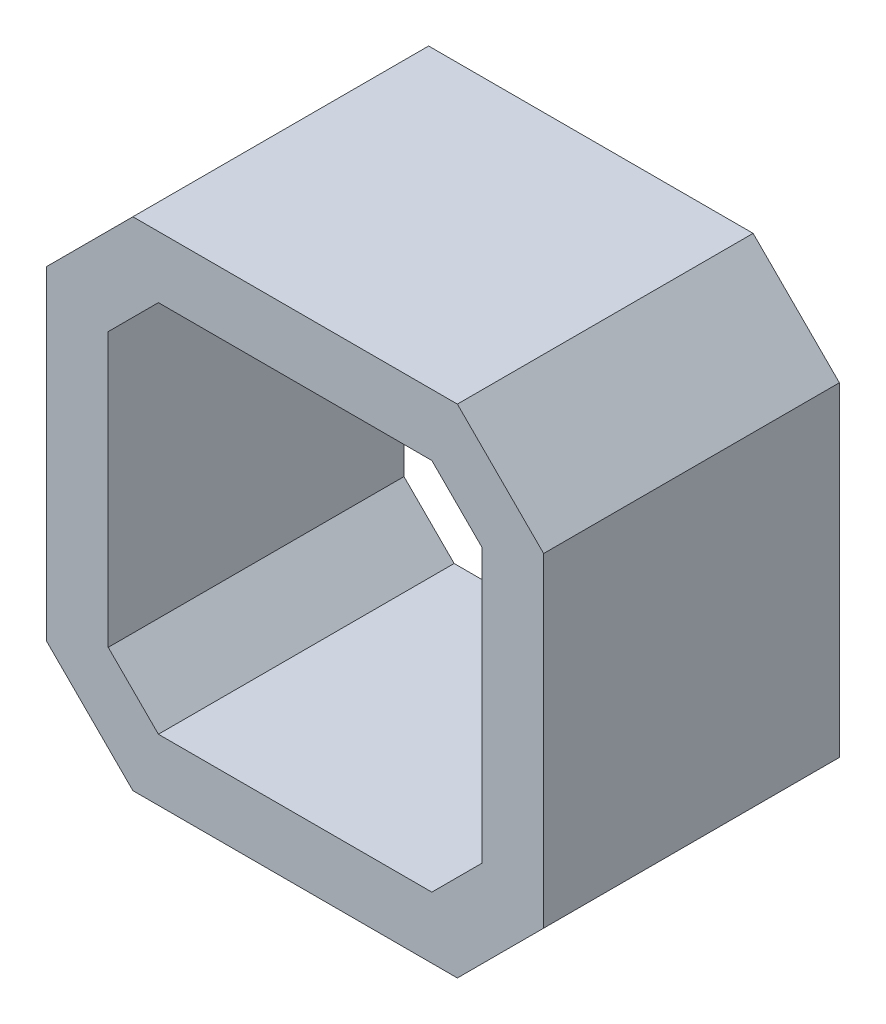
ISO-10303-21;
HEADER;
FILE_DESCRIPTION(('STEP AP214'),'2;1');
FILE_NAME('part.step','',(''),(''),'','','');
FILE_SCHEMA(('AUTOMOTIVE_DESIGN { 1 0 10303 214 1 1 1 1 }'));
ENDSEC;
DATA;
#1=APPLICATION_CONTEXT('core data for automotive mechanical design processes');
#2=APPLICATION_PROTOCOL_DEFINITION('international standard','automotive_design',2000,#1);
#3=PRODUCT_CONTEXT('',#1,'mechanical');
#4=PRODUCT('Part','Part','',(#3));
#5=PRODUCT_RELATED_PRODUCT_CATEGORY('part','',(#4));
#6=PRODUCT_DEFINITION_FORMATION('','',#4);
#7=PRODUCT_DEFINITION_CONTEXT('part definition',#1,'design');
#8=PRODUCT_DEFINITION('design','',#6,#7);
#9=PRODUCT_DEFINITION_SHAPE('','',#8);
#10=(LENGTH_UNIT() NAMED_UNIT(*) SI_UNIT(.MILLI.,.METRE.));
#11=(NAMED_UNIT(*) PLANE_ANGLE_UNIT() SI_UNIT($,.RADIAN.));
#12=(NAMED_UNIT(*) SI_UNIT($,.STERADIAN.) SOLID_ANGLE_UNIT());
#13=UNCERTAINTY_MEASURE_WITH_UNIT(LENGTH_MEASURE(1.E-05),#10,'distance_accuracy_value','');
#14=(GEOMETRIC_REPRESENTATION_CONTEXT(3) GLOBAL_UNCERTAINTY_ASSIGNED_CONTEXT((#13)) GLOBAL_UNIT_ASSIGNED_CONTEXT((#10,
#11,#12)) REPRESENTATION_CONTEXT('',''));
#15=CARTESIAN_POINT('',(0.,0.,0.));
#16=DIRECTION('',(0.,0.,1.));
#17=DIRECTION('',(1.,0.,0.));
#18=AXIS2_PLACEMENT_3D('',#15,#16,#17);
#19=CARTESIAN_POINT('',(0.,0.,-54.));
#20=DIRECTION('',(0.,0.,1.));
#21=DIRECTION('',(-1.,0.,0.));
#22=AXIS2_PLACEMENT_3D('',#19,#20,#21);
#23=PLANE('',#22);
#24=DIRECTION('',(-1.,0.,0.));
#25=VECTOR('',#24,1.);
#26=CARTESIAN_POINT('',(19.75,30.25,-54.));
#27=LINE('',#26,#25);
#28=CARTESIAN_POINT('',(19.75,30.25,-54.));
#29=VERTEX_POINT('',#28);
#30=CARTESIAN_POINT('',(-19.75,30.25,-54.));
#31=VERTEX_POINT('',#30);
#32=EDGE_CURVE('E223',#29,#31,#27,.T.);
#33=ORIENTED_EDGE('',*,*,#32,.F.);
#34=DIRECTION('',(-0.707106781186548,0.707106781186548,0.));
#35=VECTOR('',#34,1.);
#36=CARTESIAN_POINT('',(30.25,19.75,-54.));
#37=LINE('',#36,#35);
#38=CARTESIAN_POINT('',(30.25,19.75,-54.));
#39=VERTEX_POINT('',#38);
#40=EDGE_CURVE('E245',#39,#29,#37,.T.);
#41=ORIENTED_EDGE('',*,*,#40,.F.);
#42=DIRECTION('',(0.,1.,0.));
#43=VECTOR('',#42,1.);
#44=CARTESIAN_POINT('',(30.25,-19.75,-54.));
#45=LINE('',#44,#43);
#46=CARTESIAN_POINT('',(30.25,-19.75,-54.));
#47=VERTEX_POINT('',#46);
#48=EDGE_CURVE('E242',#47,#39,#45,.T.);
#49=ORIENTED_EDGE('',*,*,#48,.F.);
#50=DIRECTION('',(0.707106781186548,0.707106781186547,0.));
#51=VECTOR('',#50,1.);
#52=CARTESIAN_POINT('',(30.25,-19.75,-54.));
#53=LINE('',#52,#51);
#54=CARTESIAN_POINT('',(19.75,-30.25,-54.));
#55=VERTEX_POINT('',#54);
#56=EDGE_CURVE('E239',#55,#47,#53,.T.);
#57=ORIENTED_EDGE('',*,*,#56,.F.);
#58=DIRECTION('',(1.,0.,0.));
#59=VECTOR('',#58,1.);
#60=CARTESIAN_POINT('',(19.75,-30.25,-54.));
#61=LINE('',#60,#59);
#62=CARTESIAN_POINT('',(-19.75,-30.25,-54.));
#63=VERTEX_POINT('',#62);
#64=EDGE_CURVE('E236',#63,#55,#61,.T.);
#65=ORIENTED_EDGE('',*,*,#64,.F.);
#66=DIRECTION('',(0.707106781186548,-0.707106781186547,0.));
#67=VECTOR('',#66,1.);
#68=CARTESIAN_POINT('',(-19.75,-30.25,-54.));
#69=LINE('',#68,#67);
#70=CARTESIAN_POINT('',(-30.25,-19.75,-54.));
#71=VERTEX_POINT('',#70);
#72=EDGE_CURVE('E233',#71,#63,#69,.T.);
#73=ORIENTED_EDGE('',*,*,#72,.F.);
#74=DIRECTION('',(0.,-1.,0.));
#75=VECTOR('',#74,1.);
#76=CARTESIAN_POINT('',(-30.25,-19.75,-54.));
#77=LINE('',#76,#75);
#78=CARTESIAN_POINT('',(-30.25,19.75,-54.));
#79=VERTEX_POINT('',#78);
#80=EDGE_CURVE('E230',#79,#71,#77,.T.);
#81=ORIENTED_EDGE('',*,*,#80,.F.);
#82=DIRECTION('',(-0.707106781186548,-0.707106781186548,0.));
#83=VECTOR('',#82,1.);
#84=CARTESIAN_POINT('',(-19.75,30.25,-54.));
#85=LINE('',#84,#83);
#86=EDGE_CURVE('E226',#31,#79,#85,.T.);
#87=ORIENTED_EDGE('',*,*,#86,.F.);
#88=EDGE_LOOP('',(#33,#41,#49,#57,#65,#73,#81,#87));
#89=FACE_BOUND('',#88,.T.);
#90=DIRECTION('',(-0.707106781186548,0.707106781186548,0.));
#91=VECTOR('',#90,1.);
#92=CARTESIAN_POINT('',(22.75,16.6433982822018,-54.));
#93=LINE('',#92,#91);
#94=CARTESIAN_POINT('',(22.75,16.6433982822018,-54.));
#95=VERTEX_POINT('',#94);
#96=CARTESIAN_POINT('',(16.6433982822018,22.75,-54.));
#97=VERTEX_POINT('',#96);
#98=EDGE_CURVE('E158',#95,#97,#93,.T.);
#99=ORIENTED_EDGE('',*,*,#98,.T.);
#100=DIRECTION('',(-1.,0.,0.));
#101=VECTOR('',#100,1.);
#102=CARTESIAN_POINT('',(16.6433982822018,22.75,-54.));
#103=LINE('',#102,#101);
#104=CARTESIAN_POINT('',(-16.6433982822018,22.75,-54.));
#105=VERTEX_POINT('',#104);
#106=EDGE_CURVE('E167',#97,#105,#103,.T.);
#107=ORIENTED_EDGE('',*,*,#106,.T.);
#108=DIRECTION('',(-0.707106781186547,-0.707106781186548,0.));
#109=VECTOR('',#108,1.);
#110=CARTESIAN_POINT('',(-16.6433982822018,22.75,-54.));
#111=LINE('',#110,#109);
#112=CARTESIAN_POINT('',(-22.75,16.6433982822018,-54.));
#113=VERTEX_POINT('',#112);
#114=EDGE_CURVE('E172',#105,#113,#111,.T.);
#115=ORIENTED_EDGE('',*,*,#114,.T.);
#116=DIRECTION('',(0.,-1.,0.));
#117=VECTOR('',#116,1.);
#118=CARTESIAN_POINT('',(-22.75,-16.6433982822018,-54.));
#119=LINE('',#118,#117);
#120=CARTESIAN_POINT('',(-22.75,-16.6433982822018,-54.));
#121=VERTEX_POINT('',#120);
#122=EDGE_CURVE('E184',#113,#121,#119,.T.);
#123=ORIENTED_EDGE('',*,*,#122,.T.);
#124=DIRECTION('',(0.707106781186548,-0.707106781186547,0.));
#125=VECTOR('',#124,1.);
#126=CARTESIAN_POINT('',(-16.6433982822018,-22.75,-54.));
#127=LINE('',#126,#125);
#128=CARTESIAN_POINT('',(-16.6433982822018,-22.75,-54.));
#129=VERTEX_POINT('',#128);
#130=EDGE_CURVE('E187',#121,#129,#127,.T.);
#131=ORIENTED_EDGE('',*,*,#130,.T.);
#132=DIRECTION('',(1.,0.,0.));
#133=VECTOR('',#132,1.);
#134=CARTESIAN_POINT('',(16.6433982822018,-22.75,-54.));
#135=LINE('',#134,#133);
#136=CARTESIAN_POINT('',(16.6433982822018,-22.75,-54.));
#137=VERTEX_POINT('',#136);
#138=EDGE_CURVE('E190',#129,#137,#135,.T.);
#139=ORIENTED_EDGE('',*,*,#138,.T.);
#140=DIRECTION('',(0.707106781186548,0.707106781186547,0.));
#141=VECTOR('',#140,1.);
#142=CARTESIAN_POINT('',(22.75,-16.6433982822018,-54.));
#143=LINE('',#142,#141);
#144=CARTESIAN_POINT('',(22.75,-16.6433982822018,-54.));
#145=VERTEX_POINT('',#144);
#146=EDGE_CURVE('E193',#137,#145,#143,.T.);
#147=ORIENTED_EDGE('',*,*,#146,.T.);
#148=DIRECTION('',(0.,1.,0.));
#149=VECTOR('',#148,1.);
#150=CARTESIAN_POINT('',(22.75,-16.6433982822018,-54.));
#151=LINE('',#150,#149);
#152=EDGE_CURVE('E176',#145,#95,#151,.T.);
#153=ORIENTED_EDGE('',*,*,#152,.T.);
#154=EDGE_LOOP('',(#99,#107,#115,#123,#131,#139,#147,#153));
#155=FACE_BOUND('',#154,.T.);
#156=ADVANCED_FACE('F43',(#89,#155),#23,.F.);
#157=CARTESIAN_POINT('',(0.,0.,-18.));
#158=DIRECTION('',(0.,0.,1.));
#159=DIRECTION('',(-1.,0.,0.));
#160=AXIS2_PLACEMENT_3D('',#157,#158,#159);
#161=PLANE('',#160);
#162=DIRECTION('',(-1.,0.,0.));
#163=VECTOR('',#162,1.);
#164=CARTESIAN_POINT('',(19.75,30.25,-18.));
#165=LINE('',#164,#163);
#166=CARTESIAN_POINT('',(19.75,30.25,-18.));
#167=VERTEX_POINT('',#166);
#168=CARTESIAN_POINT('',(-19.75,30.25,-18.));
#169=VERTEX_POINT('',#168);
#170=EDGE_CURVE('E163',#167,#169,#165,.T.);
#171=ORIENTED_EDGE('',*,*,#170,.T.);
#172=DIRECTION('',(-0.707106781186548,-0.707106781186548,0.));
#173=VECTOR('',#172,1.);
#174=CARTESIAN_POINT('',(-19.75,30.25,-18.));
#175=LINE('',#174,#173);
#176=CARTESIAN_POINT('',(-30.25,19.75,-18.));
#177=VERTEX_POINT('',#176);
#178=EDGE_CURVE('E251',#169,#177,#175,.T.);
#179=ORIENTED_EDGE('',*,*,#178,.T.);
#180=DIRECTION('',(0.,-1.,0.));
#181=VECTOR('',#180,1.);
#182=CARTESIAN_POINT('',(-30.25,-19.75,-18.));
#183=LINE('',#182,#181);
#184=CARTESIAN_POINT('',(-30.25,-19.75,-18.));
#185=VERTEX_POINT('',#184);
#186=EDGE_CURVE('E254',#177,#185,#183,.T.);
#187=ORIENTED_EDGE('',*,*,#186,.T.);
#188=DIRECTION('',(0.707106781186548,-0.707106781186547,0.));
#189=VECTOR('',#188,1.);
#190=CARTESIAN_POINT('',(-19.75,-30.25,-18.));
#191=LINE('',#190,#189);
#192=CARTESIAN_POINT('',(-19.75,-30.25,-18.));
#193=VERTEX_POINT('',#192);
#194=EDGE_CURVE('E257',#185,#193,#191,.T.);
#195=ORIENTED_EDGE('',*,*,#194,.T.);
#196=DIRECTION('',(1.,0.,0.));
#197=VECTOR('',#196,1.);
#198=CARTESIAN_POINT('',(19.75,-30.25,-18.));
#199=LINE('',#198,#197);
#200=CARTESIAN_POINT('',(19.75,-30.25,-18.));
#201=VERTEX_POINT('',#200);
#202=EDGE_CURVE('E260',#193,#201,#199,.T.);
#203=ORIENTED_EDGE('',*,*,#202,.T.);
#204=DIRECTION('',(0.707106781186548,0.707106781186547,0.));
#205=VECTOR('',#204,1.);
#206=CARTESIAN_POINT('',(30.25,-19.75,-18.));
#207=LINE('',#206,#205);
#208=CARTESIAN_POINT('',(30.25,-19.75,-18.));
#209=VERTEX_POINT('',#208);
#210=EDGE_CURVE('E263',#201,#209,#207,.T.);
#211=ORIENTED_EDGE('',*,*,#210,.T.);
#212=DIRECTION('',(0.,1.,0.));
#213=VECTOR('',#212,1.);
#214=CARTESIAN_POINT('',(30.25,-19.75,-18.));
#215=LINE('',#214,#213);
#216=CARTESIAN_POINT('',(30.25,19.75,-18.));
#217=VERTEX_POINT('',#216);
#218=EDGE_CURVE('E266',#209,#217,#215,.T.);
#219=ORIENTED_EDGE('',*,*,#218,.T.);
#220=DIRECTION('',(-0.707106781186548,0.707106781186548,0.));
#221=VECTOR('',#220,1.);
#222=CARTESIAN_POINT('',(30.25,19.75,-18.));
#223=LINE('',#222,#221);
#224=EDGE_CURVE('E227',#217,#167,#223,.T.);
#225=ORIENTED_EDGE('',*,*,#224,.T.);
#226=EDGE_LOOP('',(#171,#179,#187,#195,#203,#211,#219,#225));
#227=FACE_BOUND('',#226,.T.);
#228=DIRECTION('',(0.,1.,0.));
#229=VECTOR('',#228,1.);
#230=CARTESIAN_POINT('',(22.75,-16.6433982822018,-18.));
#231=LINE('',#230,#229);
#232=CARTESIAN_POINT('',(22.75,-16.6433982822018,-18.));
#233=VERTEX_POINT('',#232);
#234=CARTESIAN_POINT('',(22.75,16.6433982822018,-18.));
#235=VERTEX_POINT('',#234);
#236=EDGE_CURVE('E177',#233,#235,#231,.T.);
#237=ORIENTED_EDGE('',*,*,#236,.F.);
#238=DIRECTION('',(0.707106781186548,0.707106781186547,0.));
#239=VECTOR('',#238,1.);
#240=CARTESIAN_POINT('',(22.75,-16.6433982822018,-18.));
#241=LINE('',#240,#239);
#242=CARTESIAN_POINT('',(16.6433982822018,-22.75,-18.));
#243=VERTEX_POINT('',#242);
#244=EDGE_CURVE('E180',#243,#233,#241,.T.);
#245=ORIENTED_EDGE('',*,*,#244,.F.);
#246=DIRECTION('',(1.,0.,0.));
#247=VECTOR('',#246,1.);
#248=CARTESIAN_POINT('',(16.6433982822018,-22.75,-18.));
#249=LINE('',#248,#247);
#250=CARTESIAN_POINT('',(-16.6433982822018,-22.75,-18.));
#251=VERTEX_POINT('',#250);
#252=EDGE_CURVE('E208',#251,#243,#249,.T.);
#253=ORIENTED_EDGE('',*,*,#252,.F.);
#254=DIRECTION('',(0.707106781186548,-0.707106781186547,0.));
#255=VECTOR('',#254,1.);
#256=CARTESIAN_POINT('',(-16.6433982822018,-22.75,-18.));
#257=LINE('',#256,#255);
#258=CARTESIAN_POINT('',(-22.75,-16.6433982822018,-18.));
#259=VERTEX_POINT('',#258);
#260=EDGE_CURVE('E205',#259,#251,#257,.T.);
#261=ORIENTED_EDGE('',*,*,#260,.F.);
#262=DIRECTION('',(0.,-1.,0.));
#263=VECTOR('',#262,1.);
#264=CARTESIAN_POINT('',(-22.75,-16.6433982822018,-18.));
#265=LINE('',#264,#263);
#266=CARTESIAN_POINT('',(-22.75,16.6433982822018,-18.));
#267=VERTEX_POINT('',#266);
#268=EDGE_CURVE('E202',#267,#259,#265,.T.);
#269=ORIENTED_EDGE('',*,*,#268,.F.);
#270=DIRECTION('',(-0.707106781186547,-0.707106781186548,0.));
#271=VECTOR('',#270,1.);
#272=CARTESIAN_POINT('',(-16.6433982822018,22.75,-18.));
#273=LINE('',#272,#271);
#274=CARTESIAN_POINT('',(-16.6433982822018,22.75,-18.));
#275=VERTEX_POINT('',#274);
#276=EDGE_CURVE('E199',#275,#267,#273,.T.);
#277=ORIENTED_EDGE('',*,*,#276,.F.);
#278=DIRECTION('',(-1.,0.,0.));
#279=VECTOR('',#278,1.);
#280=CARTESIAN_POINT('',(16.6433982822018,22.75,-18.));
#281=LINE('',#280,#279);
#282=CARTESIAN_POINT('',(16.6433982822018,22.75,-18.));
#283=VERTEX_POINT('',#282);
#284=EDGE_CURVE('E197',#283,#275,#281,.T.);
#285=ORIENTED_EDGE('',*,*,#284,.F.);
#286=DIRECTION('',(-0.707106781186548,0.707106781186548,0.));
#287=VECTOR('',#286,1.);
#288=CARTESIAN_POINT('',(22.75,16.6433982822018,-18.));
#289=LINE('',#288,#287);
#290=EDGE_CURVE('E159',#235,#283,#289,.T.);
#291=ORIENTED_EDGE('',*,*,#290,.F.);
#292=EDGE_LOOP('',(#237,#245,#253,#261,#269,#277,#285,#291));
#293=FACE_BOUND('',#292,.T.);
#294=ADVANCED_FACE('F291',(#227,#293),#161,.T.);
#295=CARTESIAN_POINT('',(19.75,30.25,-54.));
#296=DIRECTION('',(0.,-1.,0.));
#297=DIRECTION('',(1.,0.,0.));
#298=AXIS2_PLACEMENT_3D('',#295,#296,#297);
#299=PLANE('',#298);
#300=ORIENTED_EDGE('',*,*,#170,.F.);
#301=DIRECTION('',(0.,0.,1.));
#302=VECTOR('',#301,1.);
#303=CARTESIAN_POINT('',(19.75,30.25,-54.));
#304=LINE('',#303,#302);
#305=EDGE_CURVE('E248',#29,#167,#304,.T.);
#306=ORIENTED_EDGE('',*,*,#305,.F.);
#307=ORIENTED_EDGE('',*,*,#32,.T.);
#308=DIRECTION('',(0.,0.,1.));
#309=VECTOR('',#308,1.);
#310=CARTESIAN_POINT('',(-19.75,30.25,-54.));
#311=LINE('',#310,#309);
#312=EDGE_CURVE('E11',#31,#169,#311,.T.);
#313=ORIENTED_EDGE('',*,*,#312,.T.);
#314=EDGE_LOOP('',(#300,#306,#307,#313));
#315=FACE_BOUND('',#314,.T.);
#316=ADVANCED_FACE('F45',(#315),#299,.F.);
#317=CARTESIAN_POINT('',(-19.75,30.25,-54.));
#318=DIRECTION('',(0.707106781186548,-0.707106781186548,0.));
#319=DIRECTION('',(0.707106781186548,0.707106781186548,0.));
#320=AXIS2_PLACEMENT_3D('',#317,#318,#319);
#321=PLANE('',#320);
#322=ORIENTED_EDGE('',*,*,#178,.F.);
#323=ORIENTED_EDGE('',*,*,#312,.F.);
#324=ORIENTED_EDGE('',*,*,#86,.T.);
#325=DIRECTION('',(0.,0.,1.));
#326=VECTOR('',#325,1.);
#327=CARTESIAN_POINT('',(-30.25,19.75,-54.));
#328=LINE('',#327,#326);
#329=EDGE_CURVE('E51',#79,#177,#328,.T.);
#330=ORIENTED_EDGE('',*,*,#329,.T.);
#331=EDGE_LOOP('',(#322,#323,#324,#330));
#332=FACE_BOUND('',#331,.T.);
#333=ADVANCED_FACE('F284',(#332),#321,.F.);
#334=CARTESIAN_POINT('',(-30.25,-19.75,-54.));
#335=DIRECTION('',(1.,0.,0.));
#336=DIRECTION('',(0.,0.,1.));
#337=AXIS2_PLACEMENT_3D('',#334,#335,#336);
#338=PLANE('',#337);
#339=ORIENTED_EDGE('',*,*,#186,.F.);
#340=ORIENTED_EDGE('',*,*,#329,.F.);
#341=ORIENTED_EDGE('',*,*,#80,.T.);
#342=DIRECTION('',(0.,0.,1.));
#343=VECTOR('',#342,1.);
#344=CARTESIAN_POINT('',(-30.25,-19.75,-54.));
#345=LINE('',#344,#343);
#346=EDGE_CURVE('E280',#71,#185,#345,.T.);
#347=ORIENTED_EDGE('',*,*,#346,.T.);
#348=EDGE_LOOP('',(#339,#340,#341,#347));
#349=FACE_BOUND('',#348,.T.);
#350=ADVANCED_FACE('F288',(#349),#338,.F.);
#351=CARTESIAN_POINT('',(-19.75,-30.25,-54.));
#352=DIRECTION('',(0.707106781186547,0.707106781186548,0.));
#353=DIRECTION('',(-0.707106781186548,0.707106781186547,0.));
#354=AXIS2_PLACEMENT_3D('',#351,#352,#353);
#355=PLANE('',#354);
#356=ORIENTED_EDGE('',*,*,#194,.F.);
#357=ORIENTED_EDGE('',*,*,#346,.F.);
#358=ORIENTED_EDGE('',*,*,#72,.T.);
#359=DIRECTION('',(0.,0.,1.));
#360=VECTOR('',#359,1.);
#361=CARTESIAN_POINT('',(-19.75,-30.25,-54.));
#362=LINE('',#361,#360);
#363=EDGE_CURVE('E278',#63,#193,#362,.T.);
#364=ORIENTED_EDGE('',*,*,#363,.T.);
#365=EDGE_LOOP('',(#356,#357,#358,#364));
#366=FACE_BOUND('',#365,.T.);
#367=ADVANCED_FACE('F303',(#366),#355,.F.);
#368=CARTESIAN_POINT('',(19.75,-30.25,-54.));
#369=DIRECTION('',(0.,1.,0.));
#370=DIRECTION('',(-1.,0.,0.));
#371=AXIS2_PLACEMENT_3D('',#368,#369,#370);
#372=PLANE('',#371);
#373=ORIENTED_EDGE('',*,*,#202,.F.);
#374=ORIENTED_EDGE('',*,*,#363,.F.);
#375=ORIENTED_EDGE('',*,*,#64,.T.);
#376=DIRECTION('',(0.,0.,1.));
#377=VECTOR('',#376,1.);
#378=CARTESIAN_POINT('',(19.75,-30.25,-54.));
#379=LINE('',#378,#377);
#380=EDGE_CURVE('E276',#55,#201,#379,.T.);
#381=ORIENTED_EDGE('',*,*,#380,.T.);
#382=EDGE_LOOP('',(#373,#374,#375,#381));
#383=FACE_BOUND('',#382,.T.);
#384=ADVANCED_FACE('F307',(#383),#372,.F.);
#385=CARTESIAN_POINT('',(30.25,-19.75,-54.));
#386=DIRECTION('',(-0.707106781186547,0.707106781186548,0.));
#387=DIRECTION('',(-0.707106781186548,-0.707106781186547,0.));
#388=AXIS2_PLACEMENT_3D('',#385,#386,#387);
#389=PLANE('',#388);
#390=ORIENTED_EDGE('',*,*,#210,.F.);
#391=ORIENTED_EDGE('',*,*,#380,.F.);
#392=ORIENTED_EDGE('',*,*,#56,.T.);
#393=DIRECTION('',(0.,0.,1.));
#394=VECTOR('',#393,1.);
#395=CARTESIAN_POINT('',(30.25,-19.75,-54.));
#396=LINE('',#395,#394);
#397=EDGE_CURVE('E274',#47,#209,#396,.T.);
#398=ORIENTED_EDGE('',*,*,#397,.T.);
#399=EDGE_LOOP('',(#390,#391,#392,#398));
#400=FACE_BOUND('',#399,.T.);
#401=ADVANCED_FACE('F309',(#400),#389,.F.);
#402=CARTESIAN_POINT('',(30.25,-19.75,-54.));
#403=DIRECTION('',(-1.,0.,0.));
#404=DIRECTION('',(0.,0.,-1.));
#405=AXIS2_PLACEMENT_3D('',#402,#403,#404);
#406=PLANE('',#405);
#407=ORIENTED_EDGE('',*,*,#218,.F.);
#408=ORIENTED_EDGE('',*,*,#397,.F.);
#409=ORIENTED_EDGE('',*,*,#48,.T.);
#410=DIRECTION('',(0.,0.,1.));
#411=VECTOR('',#410,1.);
#412=CARTESIAN_POINT('',(30.25,19.75,-54.));
#413=LINE('',#412,#411);
#414=EDGE_CURVE('E272',#39,#217,#413,.T.);
#415=ORIENTED_EDGE('',*,*,#414,.T.);
#416=EDGE_LOOP('',(#407,#408,#409,#415));
#417=FACE_BOUND('',#416,.T.);
#418=ADVANCED_FACE('F313',(#417),#406,.F.);
#419=CARTESIAN_POINT('',(30.25,19.75,-54.));
#420=DIRECTION('',(-0.707106781186548,-0.707106781186548,0.));
#421=DIRECTION('',(0.707106781186548,-0.707106781186548,0.));
#422=AXIS2_PLACEMENT_3D('',#419,#420,#421);
#423=PLANE('',#422);
#424=ORIENTED_EDGE('',*,*,#224,.F.);
#425=ORIENTED_EDGE('',*,*,#414,.F.);
#426=ORIENTED_EDGE('',*,*,#40,.T.);
#427=ORIENTED_EDGE('',*,*,#305,.T.);
#428=EDGE_LOOP('',(#424,#425,#426,#427));
#429=FACE_BOUND('',#428,.T.);
#430=ADVANCED_FACE('F315',(#429),#423,.F.);
#431=CARTESIAN_POINT('',(22.75,16.6433982822018,-54.));
#432=DIRECTION('',(-0.707106781186548,-0.707106781186548,0.));
#433=DIRECTION('',(0.707106781186548,-0.707106781186548,0.));
#434=AXIS2_PLACEMENT_3D('',#431,#432,#433);
#435=PLANE('',#434);
#436=ORIENTED_EDGE('',*,*,#290,.T.);
#437=DIRECTION('',(0.,0.,1.));
#438=VECTOR('',#437,1.);
#439=CARTESIAN_POINT('',(16.6433982822018,22.75,-54.));
#440=LINE('',#439,#438);
#441=EDGE_CURVE('E154',#97,#283,#440,.T.);
#442=ORIENTED_EDGE('',*,*,#441,.F.);
#443=ORIENTED_EDGE('',*,*,#98,.F.);
#444=DIRECTION('',(0.,0.,1.));
#445=VECTOR('',#444,1.);
#446=CARTESIAN_POINT('',(22.75,16.6433982822018,-54.));
#447=LINE('',#446,#445);
#448=EDGE_CURVE('E66',#95,#235,#447,.T.);
#449=ORIENTED_EDGE('',*,*,#448,.T.);
#450=EDGE_LOOP('',(#436,#442,#443,#449));
#451=FACE_BOUND('',#450,.T.);
#452=ADVANCED_FACE('F156',(#451),#435,.T.);
#453=CARTESIAN_POINT('',(16.6433982822018,22.75,-54.));
#454=DIRECTION('',(0.,-1.,0.));
#455=DIRECTION('',(1.,0.,0.));
#456=AXIS2_PLACEMENT_3D('',#453,#454,#455);
#457=PLANE('',#456);
#458=ORIENTED_EDGE('',*,*,#284,.T.);
#459=DIRECTION('',(0.,0.,1.));
#460=VECTOR('',#459,1.);
#461=CARTESIAN_POINT('',(-16.6433982822018,22.75,-54.));
#462=LINE('',#461,#460);
#463=EDGE_CURVE('E164',#105,#275,#462,.T.);
#464=ORIENTED_EDGE('',*,*,#463,.F.);
#465=ORIENTED_EDGE('',*,*,#106,.F.);
#466=ORIENTED_EDGE('',*,*,#441,.T.);
#467=EDGE_LOOP('',(#458,#464,#465,#466));
#468=FACE_BOUND('',#467,.T.);
#469=ADVANCED_FACE('F168',(#468),#457,.T.);
#470=CARTESIAN_POINT('',(-16.6433982822018,22.75,-54.));
#471=DIRECTION('',(0.707106781186548,-0.707106781186547,0.));
#472=DIRECTION('',(0.707106781186547,0.707106781186548,0.));
#473=AXIS2_PLACEMENT_3D('',#470,#471,#472);
#474=PLANE('',#473);
#475=ORIENTED_EDGE('',*,*,#276,.T.);
#476=DIRECTION('',(0.,0.,1.));
#477=VECTOR('',#476,1.);
#478=CARTESIAN_POINT('',(-22.75,16.6433982822018,-54.));
#479=LINE('',#478,#477);
#480=EDGE_CURVE('E220',#113,#267,#479,.T.);
#481=ORIENTED_EDGE('',*,*,#480,.F.);
#482=ORIENTED_EDGE('',*,*,#114,.F.);
#483=ORIENTED_EDGE('',*,*,#463,.T.);
#484=EDGE_LOOP('',(#475,#481,#482,#483));
#485=FACE_BOUND('',#484,.T.);
#486=ADVANCED_FACE('F333',(#485),#474,.T.);
#487=CARTESIAN_POINT('',(-22.75,-16.6433982822018,-54.));
#488=DIRECTION('',(1.,0.,0.));
#489=DIRECTION('',(0.,0.,1.));
#490=AXIS2_PLACEMENT_3D('',#487,#488,#489);
#491=PLANE('',#490);
#492=ORIENTED_EDGE('',*,*,#268,.T.);
#493=DIRECTION('',(0.,0.,1.));
#494=VECTOR('',#493,1.);
#495=CARTESIAN_POINT('',(-22.75,-16.6433982822018,-54.));
#496=LINE('',#495,#494);
#497=EDGE_CURVE('E218',#121,#259,#496,.T.);
#498=ORIENTED_EDGE('',*,*,#497,.F.);
#499=ORIENTED_EDGE('',*,*,#122,.F.);
#500=ORIENTED_EDGE('',*,*,#480,.T.);
#501=EDGE_LOOP('',(#492,#498,#499,#500));
#502=FACE_BOUND('',#501,.T.);
#503=ADVANCED_FACE('F336',(#502),#491,.T.);
#504=CARTESIAN_POINT('',(-16.6433982822018,-22.75,-54.));
#505=DIRECTION('',(0.707106781186547,0.707106781186548,0.));
#506=DIRECTION('',(-0.707106781186548,0.707106781186547,0.));
#507=AXIS2_PLACEMENT_3D('',#504,#505,#506);
#508=PLANE('',#507);
#509=ORIENTED_EDGE('',*,*,#260,.T.);
#510=DIRECTION('',(0.,0.,1.));
#511=VECTOR('',#510,1.);
#512=CARTESIAN_POINT('',(-16.6433982822018,-22.75,-54.));
#513=LINE('',#512,#511);
#514=EDGE_CURVE('E216',#129,#251,#513,.T.);
#515=ORIENTED_EDGE('',*,*,#514,.F.);
#516=ORIENTED_EDGE('',*,*,#130,.F.);
#517=ORIENTED_EDGE('',*,*,#497,.T.);
#518=EDGE_LOOP('',(#509,#515,#516,#517));
#519=FACE_BOUND('',#518,.T.);
#520=ADVANCED_FACE('F340',(#519),#508,.T.);
#521=CARTESIAN_POINT('',(16.6433982822018,-22.75,-54.));
#522=DIRECTION('',(0.,1.,0.));
#523=DIRECTION('',(-1.,0.,0.));
#524=AXIS2_PLACEMENT_3D('',#521,#522,#523);
#525=PLANE('',#524);
#526=ORIENTED_EDGE('',*,*,#252,.T.);
#527=DIRECTION('',(0.,0.,1.));
#528=VECTOR('',#527,1.);
#529=CARTESIAN_POINT('',(16.6433982822018,-22.75,-54.));
#530=LINE('',#529,#528);
#531=EDGE_CURVE('E214',#137,#243,#530,.T.);
#532=ORIENTED_EDGE('',*,*,#531,.F.);
#533=ORIENTED_EDGE('',*,*,#138,.F.);
#534=ORIENTED_EDGE('',*,*,#514,.T.);
#535=EDGE_LOOP('',(#526,#532,#533,#534));
#536=FACE_BOUND('',#535,.T.);
#537=ADVANCED_FACE('F344',(#536),#525,.T.);
#538=CARTESIAN_POINT('',(22.75,-16.6433982822018,-54.));
#539=DIRECTION('',(-0.707106781186547,0.707106781186548,0.));
#540=DIRECTION('',(-0.707106781186548,-0.707106781186547,0.));
#541=AXIS2_PLACEMENT_3D('',#538,#539,#540);
#542=PLANE('',#541);
#543=ORIENTED_EDGE('',*,*,#244,.T.);
#544=DIRECTION('',(0.,0.,1.));
#545=VECTOR('',#544,1.);
#546=CARTESIAN_POINT('',(22.75,-16.6433982822018,-54.));
#547=LINE('',#546,#545);
#548=EDGE_CURVE('E58',#145,#233,#547,.T.);
#549=ORIENTED_EDGE('',*,*,#548,.F.);
#550=ORIENTED_EDGE('',*,*,#146,.F.);
#551=ORIENTED_EDGE('',*,*,#531,.T.);
#552=EDGE_LOOP('',(#543,#549,#550,#551));
#553=FACE_BOUND('',#552,.T.);
#554=ADVANCED_FACE('F348',(#553),#542,.T.);
#555=CARTESIAN_POINT('',(22.75,-16.6433982822018,-54.));
#556=DIRECTION('',(-1.,0.,0.));
#557=DIRECTION('',(0.,0.,-1.));
#558=AXIS2_PLACEMENT_3D('',#555,#556,#557);
#559=PLANE('',#558);
#560=ORIENTED_EDGE('',*,*,#236,.T.);
#561=ORIENTED_EDGE('',*,*,#448,.F.);
#562=ORIENTED_EDGE('',*,*,#152,.F.);
#563=ORIENTED_EDGE('',*,*,#548,.T.);
#564=EDGE_LOOP('',(#560,#561,#562,#563));
#565=FACE_BOUND('',#564,.T.);
#566=ADVANCED_FACE('F352',(#565),#559,.T.);
#567=CLOSED_SHELL('',(#156,#294,#316,#333,#350,#367,#384,#401,#418,#430,#452,#469,#486,#503,
#520,#537,#554,#566));
#568=MANIFOLD_SOLID_BREP('B2',#567);
#569=ADVANCED_BREP_SHAPE_REPRESENTATION('',(#18,#568),#14);
#570=SHAPE_DEFINITION_REPRESENTATION(#9,#569);
ENDSEC;
END-ISO-10303-21;
